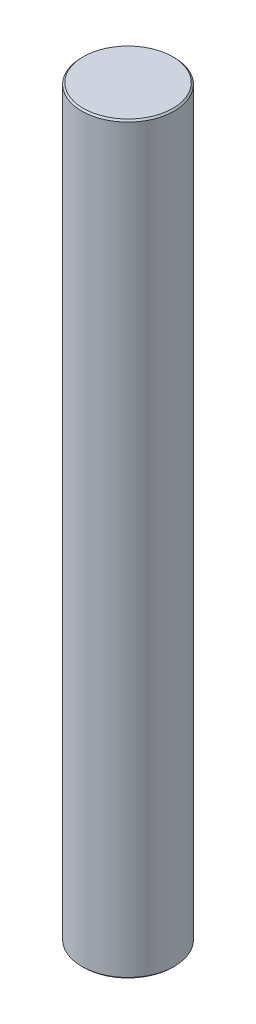
ISO-10303-21;
HEADER;
FILE_DESCRIPTION(('STEP AP214'),'2;1');
FILE_NAME('part.step','',(''),(''),'','','');
FILE_SCHEMA(('AUTOMOTIVE_DESIGN { 1 0 10303 214 1 1 1 1 }'));
ENDSEC;
DATA;
#1=APPLICATION_CONTEXT('core data for automotive mechanical design processes');
#2=APPLICATION_PROTOCOL_DEFINITION('international standard','automotive_design',2000,#1);
#3=PRODUCT_CONTEXT('',#1,'mechanical');
#4=PRODUCT('Part','Part','',(#3));
#5=PRODUCT_RELATED_PRODUCT_CATEGORY('part','',(#4));
#6=PRODUCT_DEFINITION_FORMATION('','',#4);
#7=PRODUCT_DEFINITION_CONTEXT('part definition',#1,'design');
#8=PRODUCT_DEFINITION('design','',#6,#7);
#9=PRODUCT_DEFINITION_SHAPE('','',#8);
#10=(LENGTH_UNIT() NAMED_UNIT(*) SI_UNIT(.MILLI.,.METRE.));
#11=(NAMED_UNIT(*) PLANE_ANGLE_UNIT() SI_UNIT($,.RADIAN.));
#12=(NAMED_UNIT(*) SI_UNIT($,.STERADIAN.) SOLID_ANGLE_UNIT());
#13=UNCERTAINTY_MEASURE_WITH_UNIT(LENGTH_MEASURE(1.E-05),#10,'distance_accuracy_value','');
#14=(GEOMETRIC_REPRESENTATION_CONTEXT(3) GLOBAL_UNCERTAINTY_ASSIGNED_CONTEXT((#13)) GLOBAL_UNIT_ASSIGNED_CONTEXT((#10,
#11,#12)) REPRESENTATION_CONTEXT('',''));
#15=CARTESIAN_POINT('',(0.,0.,0.));
#16=DIRECTION('',(0.,0.,1.));
#17=DIRECTION('',(1.,0.,0.));
#18=AXIS2_PLACEMENT_3D('',#15,#16,#17);
#19=CARTESIAN_POINT('',(14.35,-0.8,6.));
#20=DIRECTION('',(0.,1.,0.));
#21=DIRECTION('',(1.,0.,0.));
#22=AXIS2_PLACEMENT_3D('',#19,#20,#21);
#23=PLANE('',#22);
#24=CARTESIAN_POINT('',(14.35,-0.8,6.));
#25=DIRECTION('',(0.,-1.,0.));
#26=DIRECTION('',(1.,0.,0.));
#27=AXIS2_PLACEMENT_3D('',#24,#25,#26);
#28=CIRCLE('',#27,1.45);
#29=CARTESIAN_POINT('',(15.8,-0.8,6.));
#30=VERTEX_POINT('',#29);
#31=EDGE_CURVE('E10',#30,#30,#28,.T.);
#32=ORIENTED_EDGE('',*,*,#31,.F.);
#33=EDGE_LOOP('',(#32));
#34=FACE_BOUND('',#33,.T.);
#35=ADVANCED_FACE('F15',(#34),#23,.T.);
#36=CARTESIAN_POINT('',(14.35,-0.825,6.));
#37=DIRECTION('',(0.,-1.,0.));
#38=DIRECTION('',(1.,0.,0.));
#39=AXIS2_PLACEMENT_3D('',#36,#37,#38);
#40=CONICAL_SURFACE('',#39,1.475,0.785398163397);
#41=ORIENTED_EDGE('',*,*,#31,.T.);
#42=EDGE_LOOP('',(#41));
#43=FACE_BOUND('',#42,.T.);
#44=CARTESIAN_POINT('',(14.35,-0.85,6.));
#45=DIRECTION('',(0.,1.,0.));
#46=DIRECTION('',(1.,0.,0.));
#47=AXIS2_PLACEMENT_3D('',#44,#45,#46);
#48=CIRCLE('',#47,1.5);
#49=CARTESIAN_POINT('',(15.85,-0.85,6.));
#50=VERTEX_POINT('',#49);
#51=EDGE_CURVE('E22',#50,#50,#48,.T.);
#52=ORIENTED_EDGE('',*,*,#51,.T.);
#53=EDGE_LOOP('',(#52));
#54=FACE_BOUND('',#53,.T.);
#55=ADVANCED_FACE('F52',(#43,#54),#40,.T.);
#56=CARTESIAN_POINT('',(14.35,-24.9,6.));
#57=DIRECTION('',(0.,-1.,0.));
#58=DIRECTION('',(0.,0.,-1.));
#59=AXIS2_PLACEMENT_3D('',#56,#57,#58);
#60=PLANE('',#59);
#61=CARTESIAN_POINT('',(14.35,-24.9,6.));
#62=DIRECTION('',(0.,1.,0.));
#63=DIRECTION('',(1.,0.,0.));
#64=AXIS2_PLACEMENT_3D('',#61,#62,#63);
#65=CIRCLE('',#64,1.45);
#66=CARTESIAN_POINT('',(15.8,-24.9,6.));
#67=VERTEX_POINT('',#66);
#68=EDGE_CURVE('E38',#67,#67,#65,.T.);
#69=ORIENTED_EDGE('',*,*,#68,.F.);
#70=EDGE_LOOP('',(#69));
#71=FACE_BOUND('',#70,.T.);
#72=ADVANCED_FACE('F49',(#71),#60,.T.);
#73=CARTESIAN_POINT('',(14.35,-24.9,6.));
#74=DIRECTION('',(0.,1.,0.));
#75=DIRECTION('',(1.,0.,0.));
#76=AXIS2_PLACEMENT_3D('',#73,#74,#75);
#77=CYLINDRICAL_SURFACE('',#76,1.5);
#78=CARTESIAN_POINT('',(14.35,-24.85,6.));
#79=DIRECTION('',(0.,-1.,0.));
#80=DIRECTION('',(1.,0.,0.));
#81=AXIS2_PLACEMENT_3D('',#78,#79,#80);
#82=CIRCLE('',#81,1.5);
#83=CARTESIAN_POINT('',(15.85,-24.85,6.));
#84=VERTEX_POINT('',#83);
#85=EDGE_CURVE('E31',#84,#84,#82,.T.);
#86=ORIENTED_EDGE('',*,*,#85,.F.);
#87=EDGE_LOOP('',(#86));
#88=FACE_BOUND('',#87,.T.);
#89=ORIENTED_EDGE('',*,*,#51,.F.);
#90=EDGE_LOOP('',(#89));
#91=FACE_BOUND('',#90,.T.);
#92=ADVANCED_FACE('F51',(#88,#91),#77,.T.);
#93=CARTESIAN_POINT('',(14.35,-24.875,6.));
#94=DIRECTION('',(0.,1.,0.));
#95=DIRECTION('',(1.,0.,0.));
#96=AXIS2_PLACEMENT_3D('',#93,#94,#95);
#97=CONICAL_SURFACE('',#96,1.475,0.785398163397);
#98=ORIENTED_EDGE('',*,*,#85,.T.);
#99=EDGE_LOOP('',(#98));
#100=FACE_BOUND('',#99,.T.);
#101=ORIENTED_EDGE('',*,*,#68,.T.);
#102=EDGE_LOOP('',(#101));
#103=FACE_BOUND('',#102,.T.);
#104=ADVANCED_FACE('F47',(#100,#103),#97,.T.);
#105=CLOSED_SHELL('',(#35,#55,#72,#92,#104));
#106=MANIFOLD_SOLID_BREP('B1',#105);
#107=ADVANCED_BREP_SHAPE_REPRESENTATION('',(#18,#106),#14);
#108=SHAPE_DEFINITION_REPRESENTATION(#9,#107);
ENDSEC;
END-ISO-10303-21;
